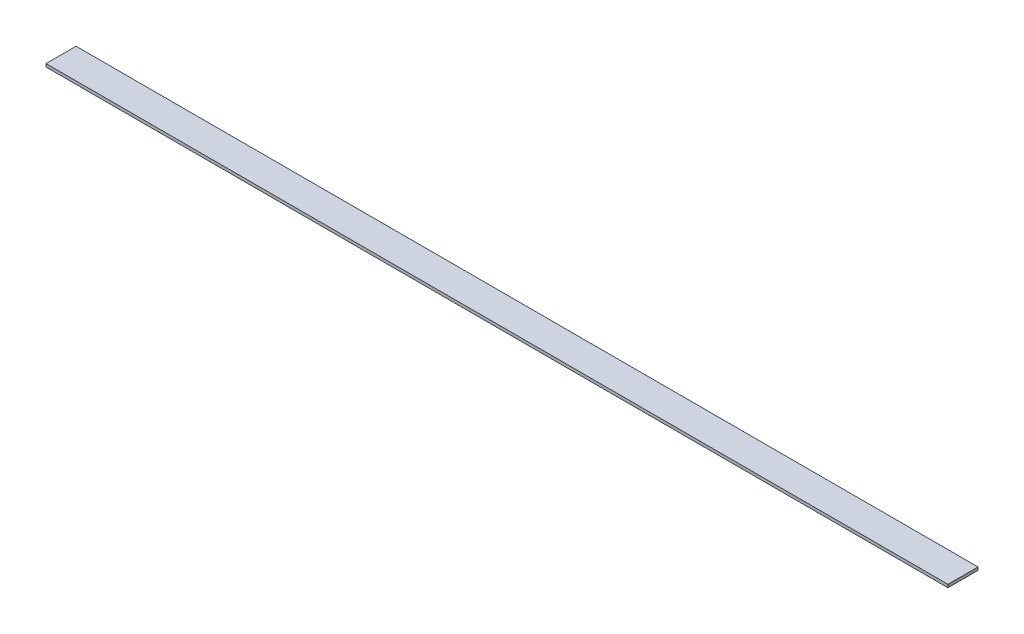
ISO-10303-21;
HEADER;
FILE_DESCRIPTION(('STEP AP214'),'2;1');
FILE_NAME('part.step','',(''),(''),'','','');
FILE_SCHEMA(('AUTOMOTIVE_DESIGN { 1 0 10303 214 1 1 1 1 }'));
ENDSEC;
DATA;
#1=APPLICATION_CONTEXT('core data for automotive mechanical design processes');
#2=APPLICATION_PROTOCOL_DEFINITION('international standard','automotive_design',2000,#1);
#3=PRODUCT_CONTEXT('',#1,'mechanical');
#4=PRODUCT('Part','Part','',(#3));
#5=PRODUCT_RELATED_PRODUCT_CATEGORY('part','',(#4));
#6=PRODUCT_DEFINITION_FORMATION('','',#4);
#7=PRODUCT_DEFINITION_CONTEXT('part definition',#1,'design');
#8=PRODUCT_DEFINITION('design','',#6,#7);
#9=PRODUCT_DEFINITION_SHAPE('','',#8);
#10=(LENGTH_UNIT() NAMED_UNIT(*) SI_UNIT(.MILLI.,.METRE.));
#11=(NAMED_UNIT(*) PLANE_ANGLE_UNIT() SI_UNIT($,.RADIAN.));
#12=(NAMED_UNIT(*) SI_UNIT($,.STERADIAN.) SOLID_ANGLE_UNIT());
#13=UNCERTAINTY_MEASURE_WITH_UNIT(LENGTH_MEASURE(1.E-05),#10,'distance_accuracy_value','');
#14=(GEOMETRIC_REPRESENTATION_CONTEXT(3) GLOBAL_UNCERTAINTY_ASSIGNED_CONTEXT((#13)) GLOBAL_UNIT_ASSIGNED_CONTEXT((#10,
#11,#12)) REPRESENTATION_CONTEXT('',''));
#15=CARTESIAN_POINT('',(0.,0.,0.));
#16=DIRECTION('',(0.,0.,1.));
#17=DIRECTION('',(1.,0.,0.));
#18=AXIS2_PLACEMENT_3D('',#15,#16,#17);
#19=CARTESIAN_POINT('',(150.,-0.5,10.));
#20=DIRECTION('',(-1.,0.,0.));
#21=DIRECTION('',(0.,0.,1.));
#22=AXIS2_PLACEMENT_3D('',#19,#20,#21);
#23=PLANE('',#22);
#24=DIRECTION('',(0.,1.,0.));
#25=VECTOR('',#24,1.);
#26=CARTESIAN_POINT('',(150.,-0.5,0.));
#27=LINE('',#26,#25);
#28=CARTESIAN_POINT('',(150.,-0.5,0.));
#29=VERTEX_POINT('',#28);
#30=CARTESIAN_POINT('',(150.,0.5,0.));
#31=VERTEX_POINT('',#30);
#32=EDGE_CURVE('E107',#29,#31,#27,.T.);
#33=ORIENTED_EDGE('',*,*,#32,.T.);
#34=DIRECTION('',(0.,0.,-1.));
#35=VECTOR('',#34,1.);
#36=CARTESIAN_POINT('',(150.,0.5,10.));
#37=LINE('',#36,#35);
#38=CARTESIAN_POINT('',(150.,0.5,10.));
#39=VERTEX_POINT('',#38);
#40=EDGE_CURVE('E11',#39,#31,#37,.T.);
#41=ORIENTED_EDGE('',*,*,#40,.F.);
#42=DIRECTION('',(0.,1.,0.));
#43=VECTOR('',#42,1.);
#44=CARTESIAN_POINT('',(150.,-0.5,10.));
#45=LINE('',#44,#43);
#46=CARTESIAN_POINT('',(150.,-0.5,10.));
#47=VERTEX_POINT('',#46);
#48=EDGE_CURVE('E91',#47,#39,#45,.T.);
#49=ORIENTED_EDGE('',*,*,#48,.F.);
#50=DIRECTION('',(0.,0.,-1.));
#51=VECTOR('',#50,1.);
#52=CARTESIAN_POINT('',(150.,-0.5,10.));
#53=LINE('',#52,#51);
#54=EDGE_CURVE('E103',#47,#29,#53,.T.);
#55=ORIENTED_EDGE('',*,*,#54,.T.);
#56=EDGE_LOOP('',(#33,#41,#49,#55));
#57=FACE_BOUND('',#56,.T.);
#58=ADVANCED_FACE('F39',(#57),#23,.F.);
#59=CARTESIAN_POINT('',(-150.,0.5,10.));
#60=DIRECTION('',(0.,-1.,0.));
#61=DIRECTION('',(0.,0.,-1.));
#62=AXIS2_PLACEMENT_3D('',#59,#60,#61);
#63=PLANE('',#62);
#64=DIRECTION('',(-1.,0.,0.));
#65=VECTOR('',#64,1.);
#66=CARTESIAN_POINT('',(-150.,0.5,0.));
#67=LINE('',#66,#65);
#68=CARTESIAN_POINT('',(-150.,0.5,0.));
#69=VERTEX_POINT('',#68);
#70=EDGE_CURVE('E96',#31,#69,#67,.T.);
#71=ORIENTED_EDGE('',*,*,#70,.T.);
#72=DIRECTION('',(0.,0.,-1.));
#73=VECTOR('',#72,1.);
#74=CARTESIAN_POINT('',(-150.,0.5,10.));
#75=LINE('',#74,#73);
#76=CARTESIAN_POINT('',(-150.,0.5,10.));
#77=VERTEX_POINT('',#76);
#78=EDGE_CURVE('E48',#77,#69,#75,.T.);
#79=ORIENTED_EDGE('',*,*,#78,.F.);
#80=DIRECTION('',(-1.,0.,0.));
#81=VECTOR('',#80,1.);
#82=CARTESIAN_POINT('',(-150.,0.5,10.));
#83=LINE('',#82,#81);
#84=EDGE_CURVE('E86',#39,#77,#83,.T.);
#85=ORIENTED_EDGE('',*,*,#84,.F.);
#86=ORIENTED_EDGE('',*,*,#40,.T.);
#87=EDGE_LOOP('',(#71,#79,#85,#86));
#88=FACE_BOUND('',#87,.T.);
#89=ADVANCED_FACE('F95',(#88),#63,.F.);
#90=CARTESIAN_POINT('',(-150.,-0.5,10.));
#91=DIRECTION('',(1.,0.,0.));
#92=DIRECTION('',(0.,0.,-1.));
#93=AXIS2_PLACEMENT_3D('',#90,#91,#92);
#94=PLANE('',#93);
#95=DIRECTION('',(0.,-1.,0.));
#96=VECTOR('',#95,1.);
#97=CARTESIAN_POINT('',(-150.,-0.5,0.));
#98=LINE('',#97,#96);
#99=CARTESIAN_POINT('',(-150.,-0.5,0.));
#100=VERTEX_POINT('',#99);
#101=EDGE_CURVE('E73',#69,#100,#98,.T.);
#102=ORIENTED_EDGE('',*,*,#101,.T.);
#103=DIRECTION('',(0.,0.,-1.));
#104=VECTOR('',#103,1.);
#105=CARTESIAN_POINT('',(-150.,-0.5,10.));
#106=LINE('',#105,#104);
#107=CARTESIAN_POINT('',(-150.,-0.5,10.));
#108=VERTEX_POINT('',#107);
#109=EDGE_CURVE('E98',#108,#100,#106,.T.);
#110=ORIENTED_EDGE('',*,*,#109,.F.);
#111=DIRECTION('',(0.,-1.,0.));
#112=VECTOR('',#111,1.);
#113=CARTESIAN_POINT('',(-150.,-0.5,10.));
#114=LINE('',#113,#112);
#115=EDGE_CURVE('E89',#77,#108,#114,.T.);
#116=ORIENTED_EDGE('',*,*,#115,.F.);
#117=ORIENTED_EDGE('',*,*,#78,.T.);
#118=EDGE_LOOP('',(#102,#110,#116,#117));
#119=FACE_BOUND('',#118,.T.);
#120=ADVANCED_FACE('F99',(#119),#94,.F.);
#121=CARTESIAN_POINT('',(-150.,-0.5,10.));
#122=DIRECTION('',(0.,1.,0.));
#123=DIRECTION('',(0.,0.,1.));
#124=AXIS2_PLACEMENT_3D('',#121,#122,#123);
#125=PLANE('',#124);
#126=DIRECTION('',(1.,0.,0.));
#127=VECTOR('',#126,1.);
#128=CARTESIAN_POINT('',(-150.,-0.5,0.));
#129=LINE('',#128,#127);
#130=EDGE_CURVE('E79',#100,#29,#129,.T.);
#131=ORIENTED_EDGE('',*,*,#130,.T.);
#132=ORIENTED_EDGE('',*,*,#54,.F.);
#133=DIRECTION('',(1.,0.,0.));
#134=VECTOR('',#133,1.);
#135=CARTESIAN_POINT('',(-150.,-0.5,10.));
#136=LINE('',#135,#134);
#137=EDGE_CURVE('E56',#108,#47,#136,.T.);
#138=ORIENTED_EDGE('',*,*,#137,.F.);
#139=ORIENTED_EDGE('',*,*,#109,.T.);
#140=EDGE_LOOP('',(#131,#132,#138,#139));
#141=FACE_BOUND('',#140,.T.);
#142=ADVANCED_FACE('F120',(#141),#125,.F.);
#143=CARTESIAN_POINT('',(0.,0.,10.));
#144=DIRECTION('',(0.,0.,-1.));
#145=DIRECTION('',(-1.,0.,0.));
#146=AXIS2_PLACEMENT_3D('',#143,#144,#145);
#147=PLANE('',#146);
#148=ORIENTED_EDGE('',*,*,#48,.T.);
#149=ORIENTED_EDGE('',*,*,#84,.T.);
#150=ORIENTED_EDGE('',*,*,#115,.T.);
#151=ORIENTED_EDGE('',*,*,#137,.T.);
#152=EDGE_LOOP('',(#148,#149,#150,#151));
#153=FACE_BOUND('',#152,.T.);
#154=ADVANCED_FACE('F87',(#153),#147,.F.);
#155=CARTESIAN_POINT('',(0.,0.,0.));
#156=DIRECTION('',(0.,0.,-1.));
#157=DIRECTION('',(-1.,0.,0.));
#158=AXIS2_PLACEMENT_3D('',#155,#156,#157);
#159=PLANE('',#158);
#160=ORIENTED_EDGE('',*,*,#32,.F.);
#161=ORIENTED_EDGE('',*,*,#130,.F.);
#162=ORIENTED_EDGE('',*,*,#101,.F.);
#163=ORIENTED_EDGE('',*,*,#70,.F.);
#164=EDGE_LOOP('',(#160,#161,#162,#163));
#165=FACE_BOUND('',#164,.T.);
#166=ADVANCED_FACE('F123',(#165),#159,.T.);
#167=CLOSED_SHELL('',(#58,#89,#120,#142,#154,#166));
#168=MANIFOLD_SOLID_BREP('B2',#167);
#169=ADVANCED_BREP_SHAPE_REPRESENTATION('',(#18,#168),#14);
#170=SHAPE_DEFINITION_REPRESENTATION(#9,#169);
ENDSEC;
END-ISO-10303-21;
